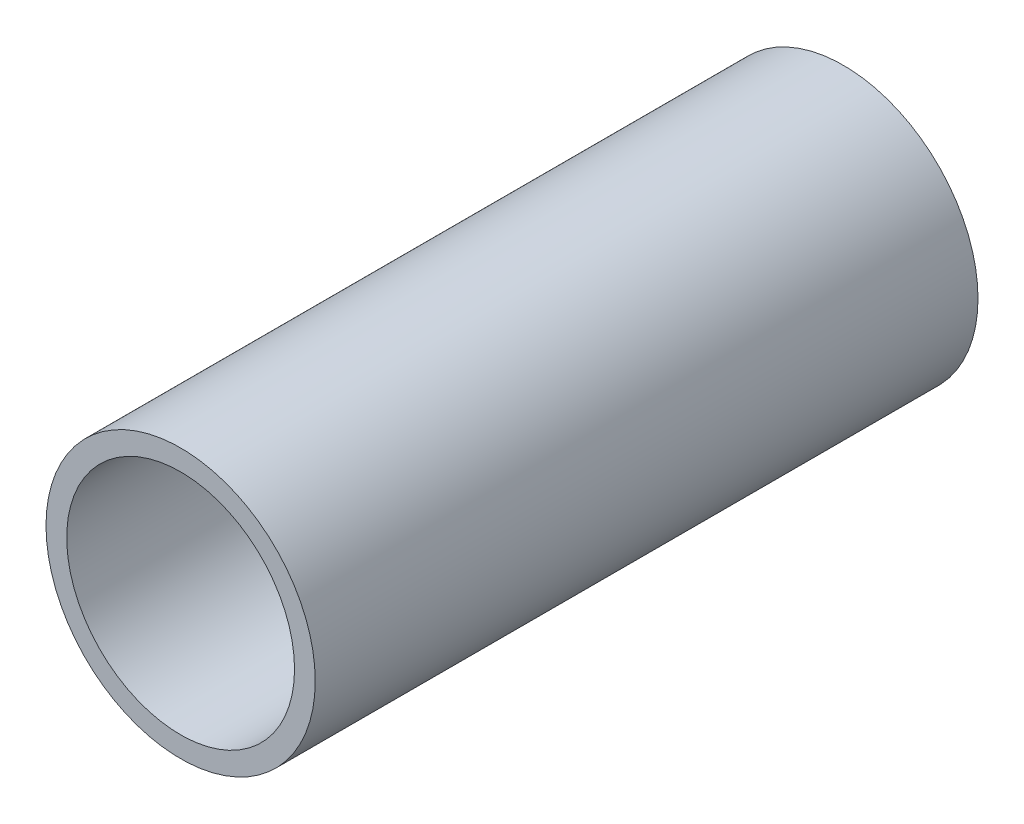
ISO-10303-21;
HEADER;
FILE_DESCRIPTION(('STEP AP214'),'2;1');
FILE_NAME('part.step','',(''),(''),'','','');
FILE_SCHEMA(('AUTOMOTIVE_DESIGN { 1 0 10303 214 1 1 1 1 }'));
ENDSEC;
DATA;
#1=APPLICATION_CONTEXT('core data for automotive mechanical design processes');
#2=APPLICATION_PROTOCOL_DEFINITION('international standard','automotive_design',2000,#1);
#3=PRODUCT_CONTEXT('',#1,'mechanical');
#4=PRODUCT('Part','Part','',(#3));
#5=PRODUCT_RELATED_PRODUCT_CATEGORY('part','',(#4));
#6=PRODUCT_DEFINITION_FORMATION('','',#4);
#7=PRODUCT_DEFINITION_CONTEXT('part definition',#1,'design');
#8=PRODUCT_DEFINITION('design','',#6,#7);
#9=PRODUCT_DEFINITION_SHAPE('','',#8);
#10=(LENGTH_UNIT() NAMED_UNIT(*) SI_UNIT(.MILLI.,.METRE.));
#11=(NAMED_UNIT(*) PLANE_ANGLE_UNIT() SI_UNIT($,.RADIAN.));
#12=(NAMED_UNIT(*) SI_UNIT($,.STERADIAN.) SOLID_ANGLE_UNIT());
#13=UNCERTAINTY_MEASURE_WITH_UNIT(LENGTH_MEASURE(1.E-05),#10,'distance_accuracy_value','');
#14=(GEOMETRIC_REPRESENTATION_CONTEXT(3) GLOBAL_UNCERTAINTY_ASSIGNED_CONTEXT((#13)) GLOBAL_UNIT_ASSIGNED_CONTEXT((#10,
#11,#12)) REPRESENTATION_CONTEXT('',''));
#15=CARTESIAN_POINT('',(0.,0.,0.));
#16=DIRECTION('',(0.,0.,1.));
#17=DIRECTION('',(1.,0.,0.));
#18=AXIS2_PLACEMENT_3D('',#15,#16,#17);
#19=CARTESIAN_POINT('',(0.,0.,80.));
#20=DIRECTION('',(0.,0.,-1.));
#21=DIRECTION('',(-1.,0.,0.));
#22=AXIS2_PLACEMENT_3D('',#19,#20,#21);
#23=CYLINDRICAL_SURFACE('',#22,32.5);
#24=CARTESIAN_POINT('',(0.,0.,80.));
#25=DIRECTION('',(0.,0.,1.));
#26=DIRECTION('',(1.,0.,0.));
#27=AXIS2_PLACEMENT_3D('',#24,#25,#26);
#28=CIRCLE('',#27,32.5);
#29=CARTESIAN_POINT('',(32.5,0.,80.));
#30=VERTEX_POINT('',#29);
#31=EDGE_CURVE('E10',#30,#30,#28,.T.);
#32=ORIENTED_EDGE('',*,*,#31,.F.);
#33=EDGE_LOOP('',(#32));
#34=FACE_BOUND('',#33,.T.);
#35=CARTESIAN_POINT('',(0.,0.,-80.));
#36=DIRECTION('',(0.,0.,1.));
#37=DIRECTION('',(1.,0.,0.));
#38=AXIS2_PLACEMENT_3D('',#35,#36,#37);
#39=CIRCLE('',#38,32.5);
#40=CARTESIAN_POINT('',(32.5,0.,-80.));
#41=VERTEX_POINT('',#40);
#42=EDGE_CURVE('E40',#41,#41,#39,.T.);
#43=ORIENTED_EDGE('',*,*,#42,.T.);
#44=EDGE_LOOP('',(#43));
#45=FACE_BOUND('',#44,.T.);
#46=ADVANCED_FACE('F37',(#34,#45),#23,.T.);
#47=CARTESIAN_POINT('',(0.,0.,80.));
#48=DIRECTION('',(0.,0.,1.));
#49=DIRECTION('',(1.,0.,0.));
#50=AXIS2_PLACEMENT_3D('',#47,#48,#49);
#51=PLANE('',#50);
#52=CARTESIAN_POINT('',(0.,0.,80.));
#53=DIRECTION('',(0.,0.,1.));
#54=DIRECTION('',(1.,0.,0.));
#55=AXIS2_PLACEMENT_3D('',#52,#53,#54);
#56=CIRCLE('',#55,27.5);
#57=CARTESIAN_POINT('',(27.5,0.,80.));
#58=VERTEX_POINT('',#57);
#59=EDGE_CURVE('E51',#58,#58,#56,.T.);
#60=ORIENTED_EDGE('',*,*,#59,.F.);
#61=EDGE_LOOP('',(#60));
#62=FACE_BOUND('',#61,.T.);
#63=ORIENTED_EDGE('',*,*,#31,.T.);
#64=EDGE_LOOP('',(#63));
#65=FACE_BOUND('',#64,.T.);
#66=ADVANCED_FACE('F68',(#62,#65),#51,.T.);
#67=CARTESIAN_POINT('',(0.,0.,-80.));
#68=DIRECTION('',(0.,0.,1.));
#69=DIRECTION('',(1.,0.,0.));
#70=AXIS2_PLACEMENT_3D('',#67,#68,#69);
#71=PLANE('',#70);
#72=CARTESIAN_POINT('',(0.,0.,-80.));
#73=DIRECTION('',(0.,0.,1.));
#74=DIRECTION('',(1.,0.,0.));
#75=AXIS2_PLACEMENT_3D('',#72,#73,#74);
#76=CIRCLE('',#75,27.5);
#77=CARTESIAN_POINT('',(27.5,0.,-80.));
#78=VERTEX_POINT('',#77);
#79=EDGE_CURVE('E49',#78,#78,#76,.T.);
#80=ORIENTED_EDGE('',*,*,#79,.T.);
#81=EDGE_LOOP('',(#80));
#82=FACE_BOUND('',#81,.T.);
#83=ORIENTED_EDGE('',*,*,#42,.F.);
#84=EDGE_LOOP('',(#83));
#85=FACE_BOUND('',#84,.T.);
#86=ADVANCED_FACE('F59',(#82,#85),#71,.F.);
#87=CARTESIAN_POINT('',(0.,0.,-80.));
#88=DIRECTION('',(0.,0.,1.));
#89=DIRECTION('',(1.,0.,0.));
#90=AXIS2_PLACEMENT_3D('',#87,#88,#89);
#91=CYLINDRICAL_SURFACE('',#90,27.5);
#92=ORIENTED_EDGE('',*,*,#79,.F.);
#93=EDGE_LOOP('',(#92));
#94=FACE_BOUND('',#93,.T.);
#95=ORIENTED_EDGE('',*,*,#59,.T.);
#96=EDGE_LOOP('',(#95));
#97=FACE_BOUND('',#96,.T.);
#98=ADVANCED_FACE('F62',(#94,#97),#91,.F.);
#99=CLOSED_SHELL('',(#46,#66,#86,#98));
#100=MANIFOLD_SOLID_BREP('B2',#99);
#101=ADVANCED_BREP_SHAPE_REPRESENTATION('',(#18,#100),#14);
#102=SHAPE_DEFINITION_REPRESENTATION(#9,#101);
ENDSEC;
END-ISO-10303-21;
